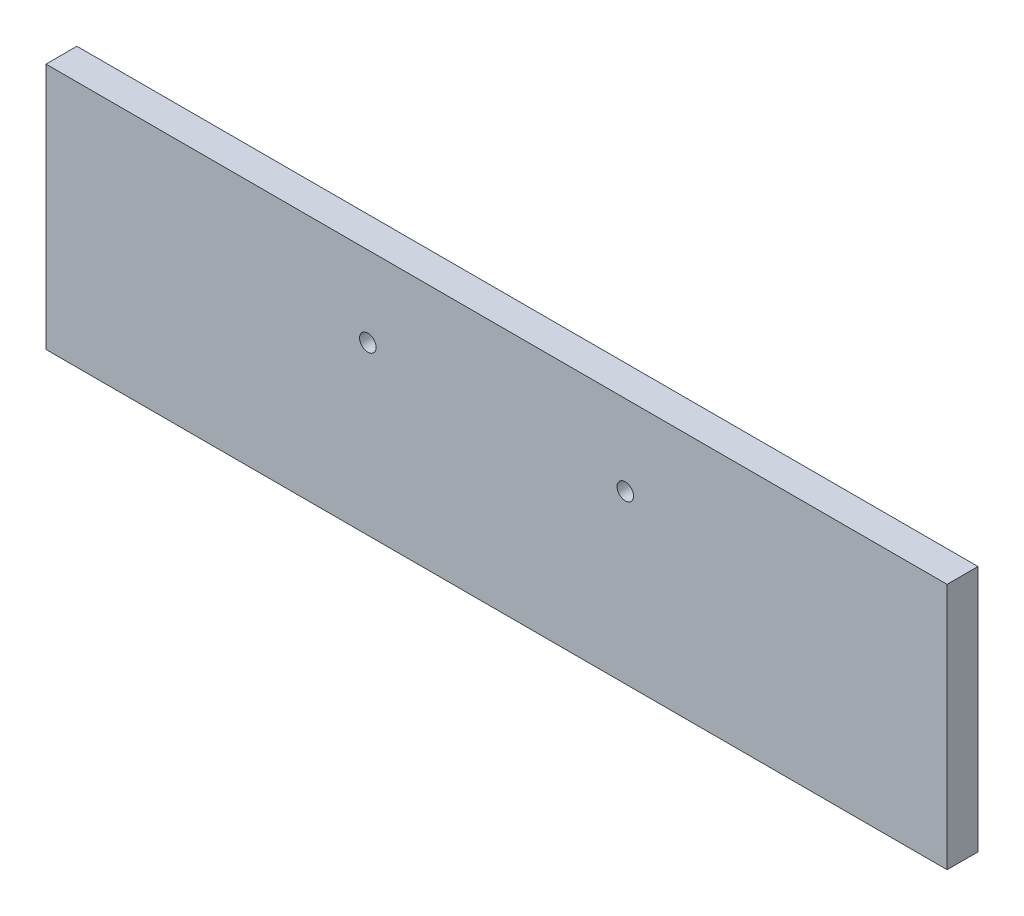
ISO-10303-21;
HEADER;
FILE_DESCRIPTION(('STEP AP214'),'2;1');
FILE_NAME('part.step','',(''),(''),'','','');
FILE_SCHEMA(('AUTOMOTIVE_DESIGN { 1 0 10303 214 1 1 1 1 }'));
ENDSEC;
DATA;
#1=APPLICATION_CONTEXT('core data for automotive mechanical design processes');
#2=APPLICATION_PROTOCOL_DEFINITION('international standard','automotive_design',2000,#1);
#3=PRODUCT_CONTEXT('',#1,'mechanical');
#4=PRODUCT('Part','Part','',(#3));
#5=PRODUCT_RELATED_PRODUCT_CATEGORY('part','',(#4));
#6=PRODUCT_DEFINITION_FORMATION('','',#4);
#7=PRODUCT_DEFINITION_CONTEXT('part definition',#1,'design');
#8=PRODUCT_DEFINITION('design','',#6,#7);
#9=PRODUCT_DEFINITION_SHAPE('','',#8);
#10=(LENGTH_UNIT() NAMED_UNIT(*) SI_UNIT(.MILLI.,.METRE.));
#11=(NAMED_UNIT(*) PLANE_ANGLE_UNIT() SI_UNIT($,.RADIAN.));
#12=(NAMED_UNIT(*) SI_UNIT($,.STERADIAN.) SOLID_ANGLE_UNIT());
#13=UNCERTAINTY_MEASURE_WITH_UNIT(LENGTH_MEASURE(1.E-05),#10,'distance_accuracy_value','');
#14=(GEOMETRIC_REPRESENTATION_CONTEXT(3) GLOBAL_UNCERTAINTY_ASSIGNED_CONTEXT((#13)) GLOBAL_UNIT_ASSIGNED_CONTEXT((#10,
#11,#12)) REPRESENTATION_CONTEXT('',''));
#15=CARTESIAN_POINT('',(0.,0.,0.));
#16=DIRECTION('',(0.,0.,1.));
#17=DIRECTION('',(1.,0.,0.));
#18=AXIS2_PLACEMENT_3D('',#15,#16,#17);
#19=CARTESIAN_POINT('',(0.,0.,6.));
#20=DIRECTION('',(0.,0.,-1.));
#21=DIRECTION('',(-1.,0.,0.));
#22=AXIS2_PLACEMENT_3D('',#19,#20,#21);
#23=PLANE('',#22);
#24=DIRECTION('',(0.,1.,0.));
#25=VECTOR('',#24,1.);
#26=CARTESIAN_POINT('',(87.5,-24.,6.));
#27=LINE('',#26,#25);
#28=CARTESIAN_POINT('',(87.5,-24.,6.));
#29=VERTEX_POINT('',#28);
#30=CARTESIAN_POINT('',(87.5,24.,6.));
#31=VERTEX_POINT('',#30);
#32=EDGE_CURVE('E98',#29,#31,#27,.T.);
#33=ORIENTED_EDGE('',*,*,#32,.T.);
#34=DIRECTION('',(-1.,0.,0.));
#35=VECTOR('',#34,1.);
#36=CARTESIAN_POINT('',(-87.5,24.,6.));
#37=LINE('',#36,#35);
#38=CARTESIAN_POINT('',(-87.5,24.,6.));
#39=VERTEX_POINT('',#38);
#40=EDGE_CURVE('E93',#31,#39,#37,.T.);
#41=ORIENTED_EDGE('',*,*,#40,.T.);
#42=DIRECTION('',(0.,-1.,0.));
#43=VECTOR('',#42,1.);
#44=CARTESIAN_POINT('',(-87.5,-24.,6.));
#45=LINE('',#44,#43);
#46=CARTESIAN_POINT('',(-87.5,-24.,6.));
#47=VERTEX_POINT('',#46);
#48=EDGE_CURVE('E96',#39,#47,#45,.T.);
#49=ORIENTED_EDGE('',*,*,#48,.T.);
#50=DIRECTION('',(1.,0.,0.));
#51=VECTOR('',#50,1.);
#52=CARTESIAN_POINT('',(-87.5,-24.,6.));
#53=LINE('',#52,#51);
#54=EDGE_CURVE('E63',#47,#29,#53,.T.);
#55=ORIENTED_EDGE('',*,*,#54,.T.);
#56=EDGE_LOOP('',(#33,#41,#49,#55));
#57=FACE_BOUND('',#56,.T.);
#58=CARTESIAN_POINT('',(-25.,8.4,6.));
#59=DIRECTION('',(0.,0.,1.));
#60=DIRECTION('',(1.,0.,0.));
#61=AXIS2_PLACEMENT_3D('',#58,#59,#60);
#62=CIRCLE('',#61,1.6);
#63=CARTESIAN_POINT('',(-23.4,8.4,6.));
#64=VERTEX_POINT('',#63);
#65=EDGE_CURVE('E118',#64,#64,#62,.T.);
#66=ORIENTED_EDGE('',*,*,#65,.F.);
#67=EDGE_LOOP('',(#66));
#68=FACE_BOUND('',#67,.T.);
#69=CARTESIAN_POINT('',(25.,8.4,6.));
#70=DIRECTION('',(0.,0.,1.));
#71=DIRECTION('',(-1.,0.,0.));
#72=AXIS2_PLACEMENT_3D('',#69,#70,#71);
#73=CIRCLE('',#72,1.6);
#74=CARTESIAN_POINT('',(23.4,8.4,6.));
#75=VERTEX_POINT('',#74);
#76=EDGE_CURVE('E140',#75,#75,#73,.T.);
#77=ORIENTED_EDGE('',*,*,#76,.F.);
#78=EDGE_LOOP('',(#77));
#79=FACE_BOUND('',#78,.T.);
#80=ADVANCED_FACE('F45',(#57,#68,#79),#23,.F.);
#81=CARTESIAN_POINT('',(0.,0.,0.));
#82=DIRECTION('',(0.,0.,-1.));
#83=DIRECTION('',(-1.,0.,0.));
#84=AXIS2_PLACEMENT_3D('',#81,#82,#83);
#85=PLANE('',#84);
#86=CARTESIAN_POINT('',(-25.,8.4,0.));
#87=DIRECTION('',(0.,0.,1.));
#88=DIRECTION('',(1.,0.,0.));
#89=AXIS2_PLACEMENT_3D('',#86,#87,#88);
#90=CIRCLE('',#89,1.6);
#91=CARTESIAN_POINT('',(-23.4,8.4,0.));
#92=VERTEX_POINT('',#91);
#93=EDGE_CURVE('E136',#92,#92,#90,.T.);
#94=ORIENTED_EDGE('',*,*,#93,.T.);
#95=EDGE_LOOP('',(#94));
#96=FACE_BOUND('',#95,.T.);
#97=DIRECTION('',(0.,1.,0.));
#98=VECTOR('',#97,1.);
#99=CARTESIAN_POINT('',(87.5,-24.,0.));
#100=LINE('',#99,#98);
#101=CARTESIAN_POINT('',(87.5,-24.,0.));
#102=VERTEX_POINT('',#101);
#103=CARTESIAN_POINT('',(87.5,24.,0.));
#104=VERTEX_POINT('',#103);
#105=EDGE_CURVE('E114',#102,#104,#100,.T.);
#106=ORIENTED_EDGE('',*,*,#105,.F.);
#107=DIRECTION('',(1.,0.,0.));
#108=VECTOR('',#107,1.);
#109=CARTESIAN_POINT('',(-87.5,-24.,0.));
#110=LINE('',#109,#108);
#111=CARTESIAN_POINT('',(-87.5,-24.,0.));
#112=VERTEX_POINT('',#111);
#113=EDGE_CURVE('E86',#112,#102,#110,.T.);
#114=ORIENTED_EDGE('',*,*,#113,.F.);
#115=DIRECTION('',(0.,-1.,0.));
#116=VECTOR('',#115,1.);
#117=CARTESIAN_POINT('',(-87.5,-24.,0.));
#118=LINE('',#117,#116);
#119=CARTESIAN_POINT('',(-87.5,24.,0.));
#120=VERTEX_POINT('',#119);
#121=EDGE_CURVE('E80',#120,#112,#118,.T.);
#122=ORIENTED_EDGE('',*,*,#121,.F.);
#123=DIRECTION('',(-1.,0.,0.));
#124=VECTOR('',#123,1.);
#125=CARTESIAN_POINT('',(-87.5,24.,0.));
#126=LINE('',#125,#124);
#127=EDGE_CURVE('E103',#104,#120,#126,.T.);
#128=ORIENTED_EDGE('',*,*,#127,.F.);
#129=EDGE_LOOP('',(#106,#114,#122,#128));
#130=FACE_BOUND('',#129,.T.);
#131=CARTESIAN_POINT('',(25.,8.4,0.));
#132=DIRECTION('',(0.,0.,1.));
#133=DIRECTION('',(-1.,0.,0.));
#134=AXIS2_PLACEMENT_3D('',#131,#132,#133);
#135=CIRCLE('',#134,1.6);
#136=CARTESIAN_POINT('',(23.4,8.4,0.));
#137=VERTEX_POINT('',#136);
#138=EDGE_CURVE('E144',#137,#137,#135,.T.);
#139=ORIENTED_EDGE('',*,*,#138,.T.);
#140=EDGE_LOOP('',(#139));
#141=FACE_BOUND('',#140,.T.);
#142=ADVANCED_FACE('F131',(#96,#130,#141),#85,.T.);
#143=CARTESIAN_POINT('',(87.5,-24.,6.));
#144=DIRECTION('',(-1.,0.,0.));
#145=DIRECTION('',(0.,0.,1.));
#146=AXIS2_PLACEMENT_3D('',#143,#144,#145);
#147=PLANE('',#146);
#148=ORIENTED_EDGE('',*,*,#105,.T.);
#149=DIRECTION('',(0.,0.,-1.));
#150=VECTOR('',#149,1.);
#151=CARTESIAN_POINT('',(87.5,24.,6.));
#152=LINE('',#151,#150);
#153=EDGE_CURVE('E11',#31,#104,#152,.T.);
#154=ORIENTED_EDGE('',*,*,#153,.F.);
#155=ORIENTED_EDGE('',*,*,#32,.F.);
#156=DIRECTION('',(0.,0.,-1.));
#157=VECTOR('',#156,1.);
#158=CARTESIAN_POINT('',(87.5,-24.,6.));
#159=LINE('',#158,#157);
#160=EDGE_CURVE('E110',#29,#102,#159,.T.);
#161=ORIENTED_EDGE('',*,*,#160,.T.);
#162=EDGE_LOOP('',(#148,#154,#155,#161));
#163=FACE_BOUND('',#162,.T.);
#164=ADVANCED_FACE('F47',(#163),#147,.F.);
#165=CARTESIAN_POINT('',(-87.5,24.,6.));
#166=DIRECTION('',(0.,-1.,0.));
#167=DIRECTION('',(0.,0.,-1.));
#168=AXIS2_PLACEMENT_3D('',#165,#166,#167);
#169=PLANE('',#168);
#170=ORIENTED_EDGE('',*,*,#127,.T.);
#171=DIRECTION('',(0.,0.,-1.));
#172=VECTOR('',#171,1.);
#173=CARTESIAN_POINT('',(-87.5,24.,6.));
#174=LINE('',#173,#172);
#175=EDGE_CURVE('E55',#39,#120,#174,.T.);
#176=ORIENTED_EDGE('',*,*,#175,.F.);
#177=ORIENTED_EDGE('',*,*,#40,.F.);
#178=ORIENTED_EDGE('',*,*,#153,.T.);
#179=EDGE_LOOP('',(#170,#176,#177,#178));
#180=FACE_BOUND('',#179,.T.);
#181=ADVANCED_FACE('F102',(#180),#169,.F.);
#182=CARTESIAN_POINT('',(-87.5,-24.,6.));
#183=DIRECTION('',(1.,0.,0.));
#184=DIRECTION('',(0.,0.,-1.));
#185=AXIS2_PLACEMENT_3D('',#182,#183,#184);
#186=PLANE('',#185);
#187=ORIENTED_EDGE('',*,*,#121,.T.);
#188=DIRECTION('',(0.,0.,-1.));
#189=VECTOR('',#188,1.);
#190=CARTESIAN_POINT('',(-87.5,-24.,6.));
#191=LINE('',#190,#189);
#192=EDGE_CURVE('E105',#47,#112,#191,.T.);
#193=ORIENTED_EDGE('',*,*,#192,.F.);
#194=ORIENTED_EDGE('',*,*,#48,.F.);
#195=ORIENTED_EDGE('',*,*,#175,.T.);
#196=EDGE_LOOP('',(#187,#193,#194,#195));
#197=FACE_BOUND('',#196,.T.);
#198=ADVANCED_FACE('F106',(#197),#186,.F.);
#199=CARTESIAN_POINT('',(-87.5,-24.,6.));
#200=DIRECTION('',(0.,1.,0.));
#201=DIRECTION('',(0.,0.,1.));
#202=AXIS2_PLACEMENT_3D('',#199,#200,#201);
#203=PLANE('',#202);
#204=ORIENTED_EDGE('',*,*,#113,.T.);
#205=ORIENTED_EDGE('',*,*,#160,.F.);
#206=ORIENTED_EDGE('',*,*,#54,.F.);
#207=ORIENTED_EDGE('',*,*,#192,.T.);
#208=EDGE_LOOP('',(#204,#205,#206,#207));
#209=FACE_BOUND('',#208,.T.);
#210=ADVANCED_FACE('F128',(#209),#203,.F.);
#211=CARTESIAN_POINT('',(-25.,8.4,6.));
#212=DIRECTION('',(0.,0.,-1.));
#213=DIRECTION('',(-1.,0.,0.));
#214=AXIS2_PLACEMENT_3D('',#211,#212,#213);
#215=CYLINDRICAL_SURFACE('',#214,1.6);
#216=ORIENTED_EDGE('',*,*,#65,.T.);
#217=EDGE_LOOP('',(#216));
#218=FACE_BOUND('',#217,.T.);
#219=ORIENTED_EDGE('',*,*,#93,.F.);
#220=EDGE_LOOP('',(#219));
#221=FACE_BOUND('',#220,.T.);
#222=ADVANCED_FACE('F163',(#218,#221),#215,.F.);
#223=CARTESIAN_POINT('',(25.,8.4,6.));
#224=DIRECTION('',(0.,0.,-1.));
#225=DIRECTION('',(-1.,0.,0.));
#226=AXIS2_PLACEMENT_3D('',#223,#224,#225);
#227=CYLINDRICAL_SURFACE('',#226,1.6);
#228=ORIENTED_EDGE('',*,*,#76,.T.);
#229=EDGE_LOOP('',(#228));
#230=FACE_BOUND('',#229,.T.);
#231=ORIENTED_EDGE('',*,*,#138,.F.);
#232=EDGE_LOOP('',(#231));
#233=FACE_BOUND('',#232,.T.);
#234=ADVANCED_FACE('F152',(#230,#233),#227,.F.);
#235=CLOSED_SHELL('',(#80,#142,#164,#181,#198,#210,#222,#234));
#236=MANIFOLD_SOLID_BREP('B2',#235);
#237=ADVANCED_BREP_SHAPE_REPRESENTATION('',(#18,#236),#14);
#238=SHAPE_DEFINITION_REPRESENTATION(#9,#237);
ENDSEC;
END-ISO-10303-21;
